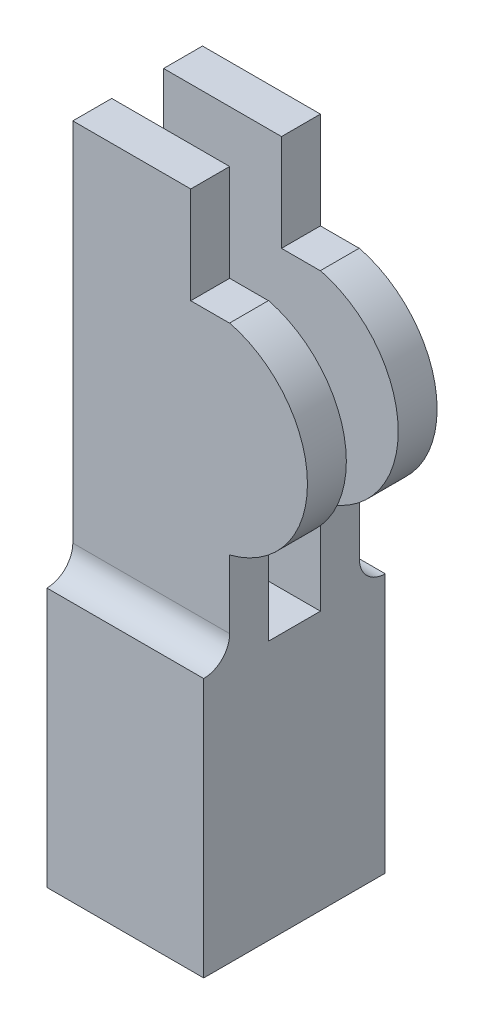
ISO-10303-21;
HEADER;
FILE_DESCRIPTION(('STEP AP214'),'2;1');
FILE_NAME('part.step','',(''),(''),'','','');
FILE_SCHEMA(('AUTOMOTIVE_DESIGN { 1 0 10303 214 1 1 1 1 }'));
ENDSEC;
DATA;
#1=APPLICATION_CONTEXT('core data for automotive mechanical design processes');
#2=APPLICATION_PROTOCOL_DEFINITION('international standard','automotive_design',2000,#1);
#3=PRODUCT_CONTEXT('',#1,'mechanical');
#4=PRODUCT('Part','Part','',(#3));
#5=PRODUCT_RELATED_PRODUCT_CATEGORY('part','',(#4));
#6=PRODUCT_DEFINITION_FORMATION('','',#4);
#7=PRODUCT_DEFINITION_CONTEXT('part definition',#1,'design');
#8=PRODUCT_DEFINITION('design','',#6,#7);
#9=PRODUCT_DEFINITION_SHAPE('','',#8);
#10=(LENGTH_UNIT() NAMED_UNIT(*) SI_UNIT(.MILLI.,.METRE.));
#11=(NAMED_UNIT(*) PLANE_ANGLE_UNIT() SI_UNIT($,.RADIAN.));
#12=(NAMED_UNIT(*) SI_UNIT($,.STERADIAN.) SOLID_ANGLE_UNIT());
#13=UNCERTAINTY_MEASURE_WITH_UNIT(LENGTH_MEASURE(1.E-05),#10,'distance_accuracy_value','');
#14=(GEOMETRIC_REPRESENTATION_CONTEXT(3) GLOBAL_UNCERTAINTY_ASSIGNED_CONTEXT((#13)) GLOBAL_UNIT_ASSIGNED_CONTEXT((#10,
#11,#12)) REPRESENTATION_CONTEXT('',''));
#15=CARTESIAN_POINT('',(0.,0.,0.));
#16=DIRECTION('',(0.,0.,1.));
#17=DIRECTION('',(1.,0.,0.));
#18=AXIS2_PLACEMENT_3D('',#15,#16,#17);
#19=CARTESIAN_POINT('',(-34.4474920895347,12.58,-16.07));
#20=DIRECTION('',(0.,0.,1.));
#21=DIRECTION('',(1.,0.,0.));
#22=AXIS2_PLACEMENT_3D('',#19,#20,#21);
#23=PLANE('',#22);
#24=CARTESIAN_POINT('',(-34.4474920895347,12.58,-16.07));
#25=DIRECTION('',(0.,0.,1.));
#26=DIRECTION('',(1.,0.,0.));
#27=AXIS2_PLACEMENT_3D('',#24,#25,#26);
#28=CIRCLE('',#27,1.25);
#29=CARTESIAN_POINT('',(-33.1974920895347,12.58,-16.07));
#30=VERTEX_POINT('',#29);
#31=EDGE_CURVE('E418',#30,#30,#28,.T.);
#32=ORIENTED_EDGE('',*,*,#31,.F.);
#33=EDGE_LOOP('',(#32));
#34=FACE_BOUND('',#33,.T.);
#35=ADVANCED_FACE('F177',(#34),#23,.F.);
#36=CARTESIAN_POINT('',(-34.45,20.18,-22.9936390438433));
#37=DIRECTION('',(1.,0.,0.));
#38=DIRECTION('',(0.,0.,-1.));
#39=AXIS2_PLACEMENT_3D('',#36,#37,#38);
#40=PLANE('',#39);
#41=DIRECTION('',(0.,0.,1.));
#42=VECTOR('',#41,1.);
#43=CARTESIAN_POINT('',(-34.45,16.4464130979525,-22.9936390438433));
#44=LINE('',#43,#42);
#45=CARTESIAN_POINT('',(-34.45,16.4464130979525,-15.47));
#46=VERTEX_POINT('',#45);
#47=CARTESIAN_POINT('',(-34.45,16.4464130979525,-13.97));
#48=VERTEX_POINT('',#47);
#49=EDGE_CURVE('E382',#46,#48,#44,.T.);
#50=ORIENTED_EDGE('',*,*,#49,.T.);
#51=DIRECTION('',(0.,1.,0.));
#52=VECTOR('',#51,1.);
#53=CARTESIAN_POINT('',(-34.45,20.18,-13.97));
#54=LINE('',#53,#52);
#55=CARTESIAN_POINT('',(-34.45,16.4529833462074,-13.97));
#56=VERTEX_POINT('',#55);
#57=EDGE_CURVE('E354',#48,#56,#54,.T.);
#58=ORIENTED_EDGE('',*,*,#57,.T.);
#59=DIRECTION('',(0.,0.,-1.));
#60=VECTOR('',#59,1.);
#61=CARTESIAN_POINT('',(-34.45,16.4529833462074,-2.65629150101518));
#62=LINE('',#61,#60);
#63=CARTESIAN_POINT('',(-34.45,16.4529833462074,-15.47));
#64=VERTEX_POINT('',#63);
#65=EDGE_CURVE('E506',#56,#64,#62,.T.);
#66=ORIENTED_EDGE('',*,*,#65,.T.);
#67=DIRECTION('',(0.,1.,0.));
#68=VECTOR('',#67,1.);
#69=CARTESIAN_POINT('',(-34.45,20.18,-15.47));
#70=LINE('',#69,#68);
#71=EDGE_CURVE('E400',#46,#64,#70,.T.);
#72=ORIENTED_EDGE('',*,*,#71,.F.);
#73=EDGE_LOOP('',(#50,#58,#66,#72));
#74=FACE_BOUND('',#73,.T.);
#75=ADVANCED_FACE('F591',(#74),#40,.F.);
#76=CARTESIAN_POINT('',(-34.45,16.4464130979525,-22.9936390438433));
#77=DIRECTION('',(0.,-1.,0.));
#78=DIRECTION('',(0.,0.,-1.));
#79=AXIS2_PLACEMENT_3D('',#76,#77,#78);
#80=PLANE('',#79);
#81=DIRECTION('',(0.,0.,1.));
#82=VECTOR('',#81,1.);
#83=CARTESIAN_POINT('',(-35.95,16.4464130979525,-22.9936390438433));
#84=LINE('',#83,#82);
#85=CARTESIAN_POINT('',(-35.95,16.4464130979525,-15.47));
#86=VERTEX_POINT('',#85);
#87=CARTESIAN_POINT('',(-35.95,16.4464130979525,-13.97));
#88=VERTEX_POINT('',#87);
#89=EDGE_CURVE('E388',#86,#88,#84,.T.);
#90=ORIENTED_EDGE('',*,*,#89,.T.);
#91=DIRECTION('',(1.,0.,0.));
#92=VECTOR('',#91,1.);
#93=CARTESIAN_POINT('',(-34.45,16.4464130979525,-13.97));
#94=LINE('',#93,#92);
#95=EDGE_CURVE('E364',#88,#48,#94,.T.);
#96=ORIENTED_EDGE('',*,*,#95,.T.);
#97=ORIENTED_EDGE('',*,*,#49,.F.);
#98=DIRECTION('',(1.,0.,0.));
#99=VECTOR('',#98,1.);
#100=CARTESIAN_POINT('',(-40.4974920895347,16.4464130979525,-15.47));
#101=LINE('',#100,#99);
#102=EDGE_CURVE('E414',#86,#46,#101,.T.);
#103=ORIENTED_EDGE('',*,*,#102,.F.);
#104=EDGE_LOOP('',(#90,#96,#97,#103));
#105=FACE_BOUND('',#104,.T.);
#106=ADVANCED_FACE('F597',(#105),#80,.F.);
#107=CARTESIAN_POINT('',(-35.95,20.18,-22.9936390438433));
#108=DIRECTION('',(-1.,0.,0.));
#109=DIRECTION('',(0.,0.,1.));
#110=AXIS2_PLACEMENT_3D('',#107,#108,#109);
#111=PLANE('',#110);
#112=DIRECTION('',(0.,0.,1.));
#113=VECTOR('',#112,1.);
#114=CARTESIAN_POINT('',(-35.95,20.18,-22.9936390438433));
#115=LINE('',#114,#113);
#116=CARTESIAN_POINT('',(-35.95,20.18,-15.47));
#117=VERTEX_POINT('',#116);
#118=CARTESIAN_POINT('',(-35.95,20.18,-13.97));
#119=VERTEX_POINT('',#118);
#120=EDGE_CURVE('E368',#117,#119,#115,.T.);
#121=ORIENTED_EDGE('',*,*,#120,.T.);
#122=DIRECTION('',(0.,-1.,0.));
#123=VECTOR('',#122,1.);
#124=CARTESIAN_POINT('',(-35.95,20.18,-13.97));
#125=LINE('',#124,#123);
#126=EDGE_CURVE('E358',#119,#88,#125,.T.);
#127=ORIENTED_EDGE('',*,*,#126,.T.);
#128=ORIENTED_EDGE('',*,*,#89,.F.);
#129=DIRECTION('',(0.,-1.,0.));
#130=VECTOR('',#129,1.);
#131=CARTESIAN_POINT('',(-35.95,20.18,-15.47));
#132=LINE('',#131,#130);
#133=EDGE_CURVE('E407',#117,#86,#132,.T.);
#134=ORIENTED_EDGE('',*,*,#133,.F.);
#135=EDGE_LOOP('',(#121,#127,#128,#134));
#136=FACE_BOUND('',#135,.T.);
#137=ADVANCED_FACE('F609',(#136),#111,.F.);
#138=CARTESIAN_POINT('',(-34.4474920895347,12.58,-16.07));
#139=DIRECTION('',(0.,0.,1.));
#140=DIRECTION('',(1.,0.,0.));
#141=AXIS2_PLACEMENT_3D('',#138,#139,#140);
#142=CYLINDRICAL_SURFACE('',#141,1.25);
#143=ORIENTED_EDGE('',*,*,#31,.T.);
#144=EDGE_LOOP('',(#143));
#145=FACE_BOUND('',#144,.T.);
#146=CARTESIAN_POINT('',(-34.4474920895347,12.58,-15.47));
#147=DIRECTION('',(0.,0.,1.));
#148=DIRECTION('',(1.,0.,0.));
#149=AXIS2_PLACEMENT_3D('',#146,#147,#148);
#150=CIRCLE('',#149,1.25);
#151=CARTESIAN_POINT('',(-33.1974920895347,12.58,-15.47));
#152=VERTEX_POINT('',#151);
#153=EDGE_CURVE('E422',#152,#152,#150,.T.);
#154=ORIENTED_EDGE('',*,*,#153,.F.);
#155=EDGE_LOOP('',(#154));
#156=FACE_BOUND('',#155,.T.);
#157=ADVANCED_FACE('F606',(#145,#156),#142,.T.);
#158=DIRECTION('',(1.,0.,0.));
#159=VECTOR('',#158,1.);
#160=CARTESIAN_POINT('',(-40.4974920895347,16.4464130979525,-17.47));
#161=LINE('',#160,#159);
#162=CARTESIAN_POINT('',(-35.95,16.4464130979525,-17.47));
#163=VERTEX_POINT('',#162);
#164=CARTESIAN_POINT('',(-34.45,16.4464130979525,-17.47));
#165=VERTEX_POINT('',#164);
#166=EDGE_CURVE('E411',#163,#165,#161,.T.);
#167=ORIENTED_EDGE('',*,*,#166,.T.);
#168=CARTESIAN_POINT('',(-34.45,16.4464130979525,-18.97));
#169=VERTEX_POINT('',#168);
#170=EDGE_CURVE('E377',#169,#165,#44,.T.);
#171=ORIENTED_EDGE('',*,*,#170,.F.);
#172=DIRECTION('',(1.,0.,0.));
#173=VECTOR('',#172,1.);
#174=CARTESIAN_POINT('',(-34.45,16.4464130979525,-18.97));
#175=LINE('',#174,#173);
#176=CARTESIAN_POINT('',(-35.95,16.4464130979525,-18.97));
#177=VERTEX_POINT('',#176);
#178=EDGE_CURVE('E378',#177,#169,#175,.T.);
#179=ORIENTED_EDGE('',*,*,#178,.F.);
#180=EDGE_CURVE('E383',#177,#163,#84,.T.);
#181=ORIENTED_EDGE('',*,*,#180,.T.);
#182=EDGE_LOOP('',(#167,#171,#179,#181));
#183=FACE_BOUND('',#182,.T.);
#184=ADVANCED_FACE('F608',(#183),#80,.F.);
#185=DIRECTION('',(0.,1.,0.));
#186=VECTOR('',#185,1.);
#187=CARTESIAN_POINT('',(-34.45,20.18,-17.47));
#188=LINE('',#187,#186);
#189=CARTESIAN_POINT('',(-34.45,16.4529833462074,-17.4699999999999));
#190=VERTEX_POINT('',#189);
#191=EDGE_CURVE('E376',#165,#190,#188,.T.);
#192=ORIENTED_EDGE('',*,*,#191,.T.);
#193=DIRECTION('',(0.,0.,1.));
#194=VECTOR('',#193,1.);
#195=CARTESIAN_POINT('',(-34.45,16.4529833462074,-32.2837084989847));
#196=LINE('',#195,#194);
#197=CARTESIAN_POINT('',(-34.45,16.4529833462074,-18.97));
#198=VERTEX_POINT('',#197);
#199=EDGE_CURVE('E462',#190,#198,#196,.F.);
#200=ORIENTED_EDGE('',*,*,#199,.T.);
#201=DIRECTION('',(0.,1.,0.));
#202=VECTOR('',#201,1.);
#203=CARTESIAN_POINT('',(-34.45,20.18,-18.97));
#204=LINE('',#203,#202);
#205=EDGE_CURVE('E372',#169,#198,#204,.T.);
#206=ORIENTED_EDGE('',*,*,#205,.F.);
#207=ORIENTED_EDGE('',*,*,#170,.T.);
#208=EDGE_LOOP('',(#192,#200,#206,#207));
#209=FACE_BOUND('',#208,.T.);
#210=ADVANCED_FACE('F600',(#209),#40,.F.);
#211=DIRECTION('',(0.,-1.,0.));
#212=VECTOR('',#211,1.);
#213=CARTESIAN_POINT('',(-35.95,20.18,-17.47));
#214=LINE('',#213,#212);
#215=CARTESIAN_POINT('',(-35.95,20.18,-17.47));
#216=VERTEX_POINT('',#215);
#217=EDGE_CURVE('E404',#216,#163,#214,.T.);
#218=ORIENTED_EDGE('',*,*,#217,.T.);
#219=ORIENTED_EDGE('',*,*,#180,.F.);
#220=DIRECTION('',(0.,-1.,0.));
#221=VECTOR('',#220,1.);
#222=CARTESIAN_POINT('',(-35.95,20.18,-18.97));
#223=LINE('',#222,#221);
#224=CARTESIAN_POINT('',(-35.95,20.18,-18.97));
#225=VERTEX_POINT('',#224);
#226=EDGE_CURVE('E384',#225,#177,#223,.T.);
#227=ORIENTED_EDGE('',*,*,#226,.F.);
#228=EDGE_CURVE('E389',#225,#216,#115,.T.);
#229=ORIENTED_EDGE('',*,*,#228,.T.);
#230=EDGE_LOOP('',(#218,#219,#227,#229));
#231=FACE_BOUND('',#230,.T.);
#232=ADVANCED_FACE('F604',(#231),#111,.F.);
#233=CARTESIAN_POINT('',(-35.45,12.58,-32.2837084989847));
#234=DIRECTION('',(0.,0.,1.));
#235=DIRECTION('',(1.,0.,0.));
#236=AXIS2_PLACEMENT_3D('',#233,#234,#235);
#237=CYLINDRICAL_SURFACE('',#236,4.00000000000001);
#238=ORIENTED_EDGE('',*,*,#199,.F.);
#239=CARTESIAN_POINT('',(-35.45,12.58,-17.4699999999999));
#240=DIRECTION('',(0.,0.,-1.));
#241=DIRECTION('',(-1.,0.,0.));
#242=AXIS2_PLACEMENT_3D('',#239,#240,#241);
#243=CIRCLE('',#242,4.00000000000001);
#244=CARTESIAN_POINT('',(-34.45,8.70701665379258,-17.4699999999999));
#245=VERTEX_POINT('',#244);
#246=EDGE_CURVE('E451',#190,#245,#243,.T.);
#247=ORIENTED_EDGE('',*,*,#246,.T.);
#248=DIRECTION('',(0.,0.,1.));
#249=VECTOR('',#248,1.);
#250=CARTESIAN_POINT('',(-34.45,8.70701665379258,-32.2837084989847));
#251=LINE('',#250,#249);
#252=CARTESIAN_POINT('',(-34.45,8.70701665379258,-18.97));
#253=VERTEX_POINT('',#252);
#254=EDGE_CURVE('E458',#253,#245,#251,.T.);
#255=ORIENTED_EDGE('',*,*,#254,.F.);
#256=CARTESIAN_POINT('',(-35.45,12.58,-18.97));
#257=DIRECTION('',(0.,0.,1.));
#258=DIRECTION('',(1.,0.,0.));
#259=AXIS2_PLACEMENT_3D('',#256,#257,#258);
#260=CIRCLE('',#259,4.00000000000001);
#261=EDGE_CURVE('E454',#253,#198,#260,.T.);
#262=ORIENTED_EDGE('',*,*,#261,.T.);
#263=EDGE_LOOP('',(#238,#247,#255,#262));
#264=FACE_BOUND('',#263,.T.);
#265=ADVANCED_FACE('F617',(#264),#237,.T.);
#266=CARTESIAN_POINT('',(0.,20.18,-32.9399999999999));
#267=DIRECTION('',(0.,1.,0.));
#268=DIRECTION('',(0.,0.,-1.));
#269=AXIS2_PLACEMENT_3D('',#266,#267,#268);
#270=PLANE('',#269);
#271=ORIENTED_EDGE('',*,*,#228,.F.);
#272=DIRECTION('',(1.,0.,0.));
#273=VECTOR('',#272,1.);
#274=CARTESIAN_POINT('',(-40.4974920895347,20.18,-18.97));
#275=LINE('',#274,#273);
#276=CARTESIAN_POINT('',(-40.4974920895347,20.18,-18.97));
#277=VERTEX_POINT('',#276);
#278=EDGE_CURVE('E473',#277,#225,#275,.T.);
#279=ORIENTED_EDGE('',*,*,#278,.F.);
#280=DIRECTION('',(0.,0.,-1.));
#281=VECTOR('',#280,1.);
#282=CARTESIAN_POINT('',(-40.4974920895347,20.18,-17.47));
#283=LINE('',#282,#281);
#284=CARTESIAN_POINT('',(-40.4974920895347,20.18,-17.47));
#285=VERTEX_POINT('',#284);
#286=EDGE_CURVE('E466',#285,#277,#283,.T.);
#287=ORIENTED_EDGE('',*,*,#286,.F.);
#288=DIRECTION('',(-1.,0.,0.));
#289=VECTOR('',#288,1.);
#290=CARTESIAN_POINT('',(-40.4974920895347,20.18,-17.47));
#291=LINE('',#290,#289);
#292=EDGE_CURVE('E470',#216,#285,#291,.T.);
#293=ORIENTED_EDGE('',*,*,#292,.F.);
#294=EDGE_LOOP('',(#271,#279,#287,#293));
#295=FACE_BOUND('',#294,.T.);
#296=ADVANCED_FACE('F620',(#295),#270,.T.);
#297=CARTESIAN_POINT('',(0.,20.18,0.));
#298=DIRECTION('',(0.,1.,0.));
#299=DIRECTION('',(0.,0.,1.));
#300=AXIS2_PLACEMENT_3D('',#297,#298,#299);
#301=PLANE('',#300);
#302=ORIENTED_EDGE('',*,*,#120,.F.);
#303=DIRECTION('',(-1.,0.,0.));
#304=VECTOR('',#303,1.);
#305=CARTESIAN_POINT('',(-40.4974920895347,20.18,-15.47));
#306=LINE('',#305,#304);
#307=CARTESIAN_POINT('',(-40.4974920895347,20.18,-15.47));
#308=VERTEX_POINT('',#307);
#309=EDGE_CURVE('E518',#117,#308,#306,.T.);
#310=ORIENTED_EDGE('',*,*,#309,.T.);
#311=DIRECTION('',(0.,0.,1.));
#312=VECTOR('',#311,1.);
#313=CARTESIAN_POINT('',(-40.4974920895347,20.18,-15.47));
#314=LINE('',#313,#312);
#315=CARTESIAN_POINT('',(-40.4974920895347,20.18,-13.97));
#316=VERTEX_POINT('',#315);
#317=EDGE_CURVE('E510',#308,#316,#314,.T.);
#318=ORIENTED_EDGE('',*,*,#317,.T.);
#319=DIRECTION('',(1.,0.,0.));
#320=VECTOR('',#319,1.);
#321=CARTESIAN_POINT('',(-40.4974920895347,20.18,-13.97));
#322=LINE('',#321,#320);
#323=EDGE_CURVE('E514',#316,#119,#322,.T.);
#324=ORIENTED_EDGE('',*,*,#323,.T.);
#325=EDGE_LOOP('',(#302,#310,#318,#324));
#326=FACE_BOUND('',#325,.T.);
#327=ADVANCED_FACE('F624',(#326),#301,.T.);
#328=CARTESIAN_POINT('',(-35.45,12.58,-2.65629150101518));
#329=DIRECTION('',(0.,0.,-1.));
#330=DIRECTION('',(-1.,0.,0.));
#331=AXIS2_PLACEMENT_3D('',#328,#329,#330);
#332=CYLINDRICAL_SURFACE('',#331,4.00000000000001);
#333=ORIENTED_EDGE('',*,*,#65,.F.);
#334=CARTESIAN_POINT('',(-35.45,12.58,-13.97));
#335=DIRECTION('',(0.,0.,-1.));
#336=DIRECTION('',(-1.,0.,0.));
#337=AXIS2_PLACEMENT_3D('',#334,#335,#336);
#338=CIRCLE('',#337,4.00000000000001);
#339=CARTESIAN_POINT('',(-34.45,8.70701665379258,-13.97));
#340=VERTEX_POINT('',#339);
#341=EDGE_CURVE('E498',#340,#56,#338,.F.);
#342=ORIENTED_EDGE('',*,*,#341,.F.);
#343=DIRECTION('',(0.,0.,-1.));
#344=VECTOR('',#343,1.);
#345=CARTESIAN_POINT('',(-34.45,8.70701665379258,-2.65629150101518));
#346=LINE('',#345,#344);
#347=CARTESIAN_POINT('',(-34.45,8.70701665379258,-15.47));
#348=VERTEX_POINT('',#347);
#349=EDGE_CURVE('E502',#348,#340,#346,.F.);
#350=ORIENTED_EDGE('',*,*,#349,.F.);
#351=CARTESIAN_POINT('',(-35.45,12.58,-15.47));
#352=DIRECTION('',(0.,0.,-1.));
#353=DIRECTION('',(-1.,0.,0.));
#354=AXIS2_PLACEMENT_3D('',#351,#352,#353);
#355=CIRCLE('',#354,4.00000000000001);
#356=EDGE_CURVE('E494',#64,#348,#355,.T.);
#357=ORIENTED_EDGE('',*,*,#356,.F.);
#358=EDGE_LOOP('',(#333,#342,#350,#357));
#359=FACE_BOUND('',#358,.T.);
#360=ADVANCED_FACE('F615',(#359),#332,.T.);
#361=CARTESIAN_POINT('',(-40.4974920895347,11.08,-25.2945553203367));
#362=DIRECTION('',(0.,-1.,0.));
#363=DIRECTION('',(0.,0.,-1.));
#364=AXIS2_PLACEMENT_3D('',#361,#362,#363);
#365=PLANE('',#364);
#366=DIRECTION('',(1.,0.,0.));
#367=VECTOR('',#366,1.);
#368=CARTESIAN_POINT('',(-40.4974920895347,11.08,-17.47));
#369=LINE('',#368,#367);
#370=CARTESIAN_POINT('',(-40.4974920895347,11.08,-17.47));
#371=VERTEX_POINT('',#370);
#372=CARTESIAN_POINT('',(-38.4974920895347,11.08,-17.47));
#373=VERTEX_POINT('',#372);
#374=EDGE_CURVE('E447',#371,#373,#369,.T.);
#375=ORIENTED_EDGE('',*,*,#374,.F.);
#376=DIRECTION('',(0.,0.,1.));
#377=VECTOR('',#376,1.);
#378=CARTESIAN_POINT('',(-40.4974920895347,11.08,-25.2945553203367));
#379=LINE('',#378,#377);
#380=CARTESIAN_POINT('',(-40.4974920895347,11.08,-15.47));
#381=VERTEX_POINT('',#380);
#382=EDGE_CURVE('E426',#371,#381,#379,.T.);
#383=ORIENTED_EDGE('',*,*,#382,.T.);
#384=DIRECTION('',(1.,0.,0.));
#385=VECTOR('',#384,1.);
#386=CARTESIAN_POINT('',(-40.4974920895347,11.08,-15.47));
#387=LINE('',#386,#385);
#388=CARTESIAN_POINT('',(-38.4974920895347,11.08,-15.47));
#389=VERTEX_POINT('',#388);
#390=EDGE_CURVE('E432',#381,#389,#387,.T.);
#391=ORIENTED_EDGE('',*,*,#390,.T.);
#392=DIRECTION('',(0.,0.,1.));
#393=VECTOR('',#392,1.);
#394=CARTESIAN_POINT('',(-38.4974920895347,11.08,-25.2945553203367));
#395=LINE('',#394,#393);
#396=EDGE_CURVE('E431',#373,#389,#395,.T.);
#397=ORIENTED_EDGE('',*,*,#396,.F.);
#398=EDGE_LOOP('',(#375,#383,#391,#397));
#399=FACE_BOUND('',#398,.T.);
#400=ADVANCED_FACE('F612',(#399),#365,.F.);
#401=CARTESIAN_POINT('',(-40.4974920895347,20.18,-18.97));
#402=DIRECTION('',(0.,0.,-1.));
#403=DIRECTION('',(-1.,0.,0.));
#404=AXIS2_PLACEMENT_3D('',#401,#402,#403);
#405=PLANE('',#404);
#406=ORIENTED_EDGE('',*,*,#226,.T.);
#407=ORIENTED_EDGE('',*,*,#178,.T.);
#408=ORIENTED_EDGE('',*,*,#205,.T.);
#409=ORIENTED_EDGE('',*,*,#261,.F.);
#410=DIRECTION('',(0.,-1.,0.));
#411=VECTOR('',#410,1.);
#412=CARTESIAN_POINT('',(-34.45,20.18,-18.97));
#413=LINE('',#412,#411);
#414=CARTESIAN_POINT('',(-34.45,6.08,-18.97));
#415=VERTEX_POINT('',#414);
#416=EDGE_CURVE('E483',#253,#415,#413,.T.);
#417=ORIENTED_EDGE('',*,*,#416,.T.);
#418=DIRECTION('',(1.,0.,0.));
#419=VECTOR('',#418,1.);
#420=CARTESIAN_POINT('',(-40.4974920895347,6.08,-18.97));
#421=LINE('',#420,#419);
#422=CARTESIAN_POINT('',(-40.4974920895347,6.08,-18.97));
#423=VERTEX_POINT('',#422);
#424=EDGE_CURVE('E545',#415,#423,#421,.F.);
#425=ORIENTED_EDGE('',*,*,#424,.T.);
#426=DIRECTION('',(0.,-1.,0.));
#427=VECTOR('',#426,1.);
#428=CARTESIAN_POINT('',(-40.4974920895347,20.18,-18.97));
#429=LINE('',#428,#427);
#430=EDGE_CURVE('E477',#277,#423,#429,.T.);
#431=ORIENTED_EDGE('',*,*,#430,.F.);
#432=ORIENTED_EDGE('',*,*,#278,.T.);
#433=EDGE_LOOP('',(#406,#407,#408,#409,#417,#425,#431,#432));
#434=FACE_BOUND('',#433,.T.);
#435=ADVANCED_FACE('F577',(#434),#405,.T.);
#436=CARTESIAN_POINT('',(-40.4974920895347,20.18,-13.97));
#437=DIRECTION('',(0.,0.,-1.));
#438=DIRECTION('',(-1.,0.,0.));
#439=AXIS2_PLACEMENT_3D('',#436,#437,#438);
#440=PLANE('',#439);
#441=ORIENTED_EDGE('',*,*,#95,.F.);
#442=ORIENTED_EDGE('',*,*,#126,.F.);
#443=ORIENTED_EDGE('',*,*,#323,.F.);
#444=DIRECTION('',(0.,-1.,0.));
#445=VECTOR('',#444,1.);
#446=CARTESIAN_POINT('',(-40.4974920895347,20.18,-13.97));
#447=LINE('',#446,#445);
#448=CARTESIAN_POINT('',(-40.4974920895347,6.08,-13.97));
#449=VERTEX_POINT('',#448);
#450=EDGE_CURVE('E535',#316,#449,#447,.T.);
#451=ORIENTED_EDGE('',*,*,#450,.T.);
#452=DIRECTION('',(1.,0.,0.));
#453=VECTOR('',#452,1.);
#454=CARTESIAN_POINT('',(-34.45,6.08,-13.97));
#455=LINE('',#454,#453);
#456=CARTESIAN_POINT('',(-34.45,6.08,-13.97));
#457=VERTEX_POINT('',#456);
#458=EDGE_CURVE('E548',#449,#457,#455,.T.);
#459=ORIENTED_EDGE('',*,*,#458,.T.);
#460=DIRECTION('',(0.,-1.,0.));
#461=VECTOR('',#460,1.);
#462=CARTESIAN_POINT('',(-34.45,20.18,-13.97));
#463=LINE('',#462,#461);
#464=EDGE_CURVE('E531',#340,#457,#463,.T.);
#465=ORIENTED_EDGE('',*,*,#464,.F.);
#466=ORIENTED_EDGE('',*,*,#341,.T.);
#467=ORIENTED_EDGE('',*,*,#57,.F.);
#468=EDGE_LOOP('',(#441,#442,#443,#451,#459,#465,#466,#467));
#469=FACE_BOUND('',#468,.T.);
#470=ADVANCED_FACE('F586',(#469),#440,.F.);
#471=CARTESIAN_POINT('',(-38.4974920895347,5.08,-25.2945553203367));
#472=DIRECTION('',(-1.,0.,0.));
#473=DIRECTION('',(0.,0.,1.));
#474=AXIS2_PLACEMENT_3D('',#471,#472,#473);
#475=PLANE('',#474);
#476=DIRECTION('',(0.,-1.,0.));
#477=VECTOR('',#476,1.);
#478=CARTESIAN_POINT('',(-38.4974920895347,20.18,-17.47));
#479=LINE('',#478,#477);
#480=CARTESIAN_POINT('',(-38.4974920895347,5.08,-17.47));
#481=VERTEX_POINT('',#480);
#482=EDGE_CURVE('E443',#373,#481,#479,.T.);
#483=ORIENTED_EDGE('',*,*,#482,.F.);
#484=ORIENTED_EDGE('',*,*,#396,.T.);
#485=DIRECTION('',(0.,-1.,0.));
#486=VECTOR('',#485,1.);
#487=CARTESIAN_POINT('',(-38.4974920895347,5.08,-15.47));
#488=LINE('',#487,#486);
#489=CARTESIAN_POINT('',(-38.4974920895347,5.08,-15.47));
#490=VERTEX_POINT('',#489);
#491=EDGE_CURVE('E427',#389,#490,#488,.T.);
#492=ORIENTED_EDGE('',*,*,#491,.T.);
#493=DIRECTION('',(0.,0.,1.));
#494=VECTOR('',#493,1.);
#495=CARTESIAN_POINT('',(-38.4974920895347,5.08,-25.2945553203367));
#496=LINE('',#495,#494);
#497=EDGE_CURVE('E430',#481,#490,#496,.T.);
#498=ORIENTED_EDGE('',*,*,#497,.F.);
#499=EDGE_LOOP('',(#483,#484,#492,#498));
#500=FACE_BOUND('',#499,.T.);
#501=ADVANCED_FACE('F581',(#500),#475,.F.);
#502=CARTESIAN_POINT('',(0.,6.08,-19.97));
#503=DIRECTION('',(1.,0.,0.));
#504=DIRECTION('',(0.,0.,-1.));
#505=AXIS2_PLACEMENT_3D('',#502,#503,#504);
#506=CYLINDRICAL_SURFACE('',#505,1.);
#507=CARTESIAN_POINT('',(-40.4974920895347,6.08,-19.97));
#508=DIRECTION('',(1.,0.,0.));
#509=DIRECTION('',(0.,0.,-1.));
#510=AXIS2_PLACEMENT_3D('',#507,#508,#509);
#511=CIRCLE('',#510,1.);
#512=CARTESIAN_POINT('',(-40.4974920895347,5.08,-19.97));
#513=VERTEX_POINT('',#512);
#514=EDGE_CURVE('E351',#423,#513,#511,.T.);
#515=ORIENTED_EDGE('',*,*,#514,.F.);
#516=ORIENTED_EDGE('',*,*,#424,.F.);
#517=CARTESIAN_POINT('',(-34.45,6.08,-19.97));
#518=DIRECTION('',(1.,0.,0.));
#519=DIRECTION('',(0.,0.,-1.));
#520=AXIS2_PLACEMENT_3D('',#517,#518,#519);
#521=CIRCLE('',#520,1.);
#522=CARTESIAN_POINT('',(-34.45,5.08,-19.97));
#523=VERTEX_POINT('',#522);
#524=EDGE_CURVE('E551',#523,#415,#521,.F.);
#525=ORIENTED_EDGE('',*,*,#524,.F.);
#526=DIRECTION('',(1.,0.,0.));
#527=VECTOR('',#526,1.);
#528=CARTESIAN_POINT('',(0.,5.08,-19.97));
#529=LINE('',#528,#527);
#530=EDGE_CURVE('E542',#513,#523,#529,.T.);
#531=ORIENTED_EDGE('',*,*,#530,.F.);
#532=EDGE_LOOP('',(#515,#516,#525,#531));
#533=FACE_BOUND('',#532,.T.);
#534=ADVANCED_FACE('F579',(#533),#506,.F.);
#535=CARTESIAN_POINT('',(-40.4974920895347,6.08,-12.97));
#536=DIRECTION('',(-1.,0.,0.));
#537=DIRECTION('',(0.,0.,1.));
#538=AXIS2_PLACEMENT_3D('',#535,#536,#537);
#539=CYLINDRICAL_SURFACE('',#538,1.);
#540=CARTESIAN_POINT('',(-40.4974920895347,6.08,-12.97));
#541=DIRECTION('',(1.,0.,0.));
#542=DIRECTION('',(0.,0.,-1.));
#543=AXIS2_PLACEMENT_3D('',#540,#541,#542);
#544=CIRCLE('',#543,1.);
#545=CARTESIAN_POINT('',(-40.4974920895347,5.08,-12.97));
#546=VERTEX_POINT('',#545);
#547=EDGE_CURVE('E12',#546,#449,#544,.T.);
#548=ORIENTED_EDGE('',*,*,#547,.F.);
#549=DIRECTION('',(1.,0.,0.));
#550=VECTOR('',#549,1.);
#551=CARTESIAN_POINT('',(-40.4974920895347,5.08,-12.97));
#552=LINE('',#551,#550);
#553=CARTESIAN_POINT('',(-34.45,5.08,-12.97));
#554=VERTEX_POINT('',#553);
#555=EDGE_CURVE('E538',#554,#546,#552,.F.);
#556=ORIENTED_EDGE('',*,*,#555,.F.);
#557=CARTESIAN_POINT('',(-34.45,6.08,-12.97));
#558=DIRECTION('',(-1.,0.,0.));
#559=DIRECTION('',(0.,0.,1.));
#560=AXIS2_PLACEMENT_3D('',#557,#558,#559);
#561=CIRCLE('',#560,1.);
#562=EDGE_CURVE('E186',#457,#554,#561,.T.);
#563=ORIENTED_EDGE('',*,*,#562,.F.);
#564=ORIENTED_EDGE('',*,*,#458,.F.);
#565=EDGE_LOOP('',(#548,#556,#563,#564));
#566=FACE_BOUND('',#565,.T.);
#567=ADVANCED_FACE('F179',(#566),#539,.F.);
#568=CARTESIAN_POINT('',(-34.45,20.18,-15.47));
#569=DIRECTION('',(-1.,0.,0.));
#570=DIRECTION('',(0.,0.,1.));
#571=AXIS2_PLACEMENT_3D('',#568,#569,#570);
#572=PLANE('',#571);
#573=DIRECTION('',(0.,-1.,0.));
#574=VECTOR('',#573,1.);
#575=CARTESIAN_POINT('',(-34.45,20.18,-15.47));
#576=LINE('',#575,#574);
#577=CARTESIAN_POINT('',(-34.45,5.08,-15.47));
#578=VERTEX_POINT('',#577);
#579=EDGE_CURVE('E528',#348,#578,#576,.T.);
#580=ORIENTED_EDGE('',*,*,#579,.F.);
#581=ORIENTED_EDGE('',*,*,#349,.T.);
#582=ORIENTED_EDGE('',*,*,#464,.T.);
#583=ORIENTED_EDGE('',*,*,#562,.T.);
#584=DIRECTION('',(0.,1.,0.));
#585=VECTOR('',#584,1.);
#586=CARTESIAN_POINT('',(-34.45,-4.92,-12.97));
#587=LINE('',#586,#585);
#588=CARTESIAN_POINT('',(-34.45,-4.92,-12.97));
#589=VERTEX_POINT('',#588);
#590=EDGE_CURVE('E360',#589,#554,#587,.T.);
#591=ORIENTED_EDGE('',*,*,#590,.F.);
#592=DIRECTION('',(0.,0.,1.));
#593=VECTOR('',#592,1.);
#594=CARTESIAN_POINT('',(-34.45,-4.92,-12.97));
#595=LINE('',#594,#593);
#596=CARTESIAN_POINT('',(-34.45,-4.92,-19.97));
#597=VERTEX_POINT('',#596);
#598=EDGE_CURVE('E337',#597,#589,#595,.T.);
#599=ORIENTED_EDGE('',*,*,#598,.F.);
#600=DIRECTION('',(0.,1.,0.));
#601=VECTOR('',#600,1.);
#602=CARTESIAN_POINT('',(-34.45,-4.92,-19.97));
#603=LINE('',#602,#601);
#604=EDGE_CURVE('E333',#597,#523,#603,.T.);
#605=ORIENTED_EDGE('',*,*,#604,.T.);
#606=ORIENTED_EDGE('',*,*,#524,.T.);
#607=ORIENTED_EDGE('',*,*,#416,.F.);
#608=ORIENTED_EDGE('',*,*,#254,.T.);
#609=DIRECTION('',(0.,-1.,0.));
#610=VECTOR('',#609,1.);
#611=CARTESIAN_POINT('',(-34.45,20.18,-17.47));
#612=LINE('',#611,#610);
#613=CARTESIAN_POINT('',(-34.45,5.08,-17.4699999999999));
#614=VERTEX_POINT('',#613);
#615=EDGE_CURVE('E487',#245,#614,#612,.T.);
#616=ORIENTED_EDGE('',*,*,#615,.T.);
#617=DIRECTION('',(0.,0.,1.));
#618=VECTOR('',#617,1.);
#619=CARTESIAN_POINT('',(-34.45,5.08,-12.97));
#620=LINE('',#619,#618);
#621=EDGE_CURVE('E346',#614,#578,#620,.T.);
#622=ORIENTED_EDGE('',*,*,#621,.T.);
#623=EDGE_LOOP('',(#580,#581,#582,#583,#591,#599,#605,#606,#607,#608,#616,#622));
#624=FACE_BOUND('',#623,.T.);
#625=ADVANCED_FACE('F558',(#624),#572,.F.);
#626=CARTESIAN_POINT('',(-40.4974920895347,20.18,-15.47));
#627=DIRECTION('',(1.,0.,0.));
#628=DIRECTION('',(0.,0.,-1.));
#629=AXIS2_PLACEMENT_3D('',#626,#627,#628);
#630=PLANE('',#629);
#631=ORIENTED_EDGE('',*,*,#514,.T.);
#632=DIRECTION('',(0.,1.,0.));
#633=VECTOR('',#632,1.);
#634=CARTESIAN_POINT('',(-40.4974920895347,-4.92,-19.97));
#635=LINE('',#634,#633);
#636=CARTESIAN_POINT('',(-40.4974920895347,-4.92,-19.97));
#637=VERTEX_POINT('',#636);
#638=EDGE_CURVE('E331',#637,#513,#635,.T.);
#639=ORIENTED_EDGE('',*,*,#638,.F.);
#640=DIRECTION('',(0.,0.,-1.));
#641=VECTOR('',#640,1.);
#642=CARTESIAN_POINT('',(-40.4974920895347,-4.92,-12.97));
#643=LINE('',#642,#641);
#644=CARTESIAN_POINT('',(-40.4974920895347,-4.92,-12.97));
#645=VERTEX_POINT('',#644);
#646=EDGE_CURVE('E338',#645,#637,#643,.T.);
#647=ORIENTED_EDGE('',*,*,#646,.F.);
#648=DIRECTION('',(0.,1.,0.));
#649=VECTOR('',#648,1.);
#650=CARTESIAN_POINT('',(-40.4974920895347,-4.92,-12.97));
#651=LINE('',#650,#649);
#652=EDGE_CURVE('E563',#645,#546,#651,.T.);
#653=ORIENTED_EDGE('',*,*,#652,.T.);
#654=ORIENTED_EDGE('',*,*,#547,.T.);
#655=ORIENTED_EDGE('',*,*,#450,.F.);
#656=ORIENTED_EDGE('',*,*,#317,.F.);
#657=DIRECTION('',(0.,-1.,0.));
#658=VECTOR('',#657,1.);
#659=CARTESIAN_POINT('',(-40.4974920895347,20.18,-15.47));
#660=LINE('',#659,#658);
#661=EDGE_CURVE('E521',#308,#381,#660,.T.);
#662=ORIENTED_EDGE('',*,*,#661,.T.);
#663=ORIENTED_EDGE('',*,*,#382,.F.);
#664=DIRECTION('',(0.,-1.,0.));
#665=VECTOR('',#664,1.);
#666=CARTESIAN_POINT('',(-40.4974920895347,20.18,-17.47));
#667=LINE('',#666,#665);
#668=EDGE_CURVE('E490',#285,#371,#667,.T.);
#669=ORIENTED_EDGE('',*,*,#668,.F.);
#670=ORIENTED_EDGE('',*,*,#286,.T.);
#671=ORIENTED_EDGE('',*,*,#430,.T.);
#672=EDGE_LOOP('',(#631,#639,#647,#653,#654,#655,#656,#662,#663,#669,#670,#671));
#673=FACE_BOUND('',#672,.T.);
#674=ADVANCED_FACE('F348',(#673),#630,.F.);
#675=CARTESIAN_POINT('',(-40.4974920895347,20.18,-17.47));
#676=DIRECTION('',(0.,0.,1.));
#677=DIRECTION('',(1.,0.,0.));
#678=AXIS2_PLACEMENT_3D('',#675,#676,#677);
#679=PLANE('',#678);
#680=ORIENTED_EDGE('',*,*,#217,.F.);
#681=ORIENTED_EDGE('',*,*,#292,.T.);
#682=ORIENTED_EDGE('',*,*,#668,.T.);
#683=ORIENTED_EDGE('',*,*,#374,.T.);
#684=ORIENTED_EDGE('',*,*,#482,.T.);
#685=DIRECTION('',(-1.,0.,0.));
#686=VECTOR('',#685,1.);
#687=CARTESIAN_POINT('',(-40.4974920895347,5.08,-17.47));
#688=LINE('',#687,#686);
#689=EDGE_CURVE('E465',#614,#481,#688,.T.);
#690=ORIENTED_EDGE('',*,*,#689,.F.);
#691=ORIENTED_EDGE('',*,*,#615,.F.);
#692=ORIENTED_EDGE('',*,*,#246,.F.);
#693=ORIENTED_EDGE('',*,*,#191,.F.);
#694=ORIENTED_EDGE('',*,*,#166,.F.);
#695=EDGE_LOOP('',(#680,#681,#682,#683,#684,#690,#691,#692,#693,#694));
#696=FACE_BOUND('',#695,.T.);
#697=ADVANCED_FACE('F628',(#696),#679,.T.);
#698=CARTESIAN_POINT('',(-40.4974920895347,20.18,-15.47));
#699=DIRECTION('',(0.,0.,1.));
#700=DIRECTION('',(1.,0.,0.));
#701=AXIS2_PLACEMENT_3D('',#698,#699,#700);
#702=PLANE('',#701);
#703=ORIENTED_EDGE('',*,*,#153,.T.);
#704=EDGE_LOOP('',(#703));
#705=FACE_BOUND('',#704,.T.);
#706=ORIENTED_EDGE('',*,*,#309,.F.);
#707=ORIENTED_EDGE('',*,*,#133,.T.);
#708=ORIENTED_EDGE('',*,*,#102,.T.);
#709=ORIENTED_EDGE('',*,*,#71,.T.);
#710=ORIENTED_EDGE('',*,*,#356,.T.);
#711=ORIENTED_EDGE('',*,*,#579,.T.);
#712=DIRECTION('',(-1.,0.,0.));
#713=VECTOR('',#712,1.);
#714=CARTESIAN_POINT('',(-40.4974920895347,5.08,-15.47));
#715=LINE('',#714,#713);
#716=EDGE_CURVE('E509',#578,#490,#715,.T.);
#717=ORIENTED_EDGE('',*,*,#716,.T.);
#718=ORIENTED_EDGE('',*,*,#491,.F.);
#719=ORIENTED_EDGE('',*,*,#390,.F.);
#720=ORIENTED_EDGE('',*,*,#661,.F.);
#721=EDGE_LOOP('',(#706,#707,#708,#709,#710,#711,#717,#718,#719,#720));
#722=FACE_BOUND('',#721,.T.);
#723=ADVANCED_FACE('F631',(#705,#722),#702,.F.);
#724=CARTESIAN_POINT('',(-40.4974920895347,-4.92,-19.97));
#725=DIRECTION('',(0.,0.,1.));
#726=DIRECTION('',(1.,0.,0.));
#727=AXIS2_PLACEMENT_3D('',#724,#725,#726);
#728=PLANE('',#727);
#729=ORIENTED_EDGE('',*,*,#530,.T.);
#730=ORIENTED_EDGE('',*,*,#604,.F.);
#731=DIRECTION('',(1.,0.,0.));
#732=VECTOR('',#731,1.);
#733=CARTESIAN_POINT('',(-40.4974920895347,-4.92,-19.97));
#734=LINE('',#733,#732);
#735=EDGE_CURVE('E326',#637,#597,#734,.T.);
#736=ORIENTED_EDGE('',*,*,#735,.F.);
#737=ORIENTED_EDGE('',*,*,#638,.T.);
#738=EDGE_LOOP('',(#729,#730,#736,#737));
#739=FACE_BOUND('',#738,.T.);
#740=ADVANCED_FACE('F329',(#739),#728,.F.);
#741=CARTESIAN_POINT('',(-40.4974920895347,-4.92,-12.97));
#742=DIRECTION('',(0.,0.,-1.));
#743=DIRECTION('',(-1.,0.,0.));
#744=AXIS2_PLACEMENT_3D('',#741,#742,#743);
#745=PLANE('',#744);
#746=ORIENTED_EDGE('',*,*,#555,.T.);
#747=ORIENTED_EDGE('',*,*,#652,.F.);
#748=DIRECTION('',(-1.,0.,0.));
#749=VECTOR('',#748,1.);
#750=CARTESIAN_POINT('',(-40.4974920895347,-4.92,-12.97));
#751=LINE('',#750,#749);
#752=EDGE_CURVE('E343',#589,#645,#751,.T.);
#753=ORIENTED_EDGE('',*,*,#752,.F.);
#754=ORIENTED_EDGE('',*,*,#590,.T.);
#755=EDGE_LOOP('',(#746,#747,#753,#754));
#756=FACE_BOUND('',#755,.T.);
#757=ADVANCED_FACE('F561',(#756),#745,.F.);
#758=CARTESIAN_POINT('',(0.,-4.92,0.));
#759=DIRECTION('',(0.,-1.,0.));
#760=DIRECTION('',(0.,0.,-1.));
#761=AXIS2_PLACEMENT_3D('',#758,#759,#760);
#762=PLANE('',#761);
#763=ORIENTED_EDGE('',*,*,#646,.T.);
#764=ORIENTED_EDGE('',*,*,#735,.T.);
#765=ORIENTED_EDGE('',*,*,#598,.T.);
#766=ORIENTED_EDGE('',*,*,#752,.T.);
#767=EDGE_LOOP('',(#763,#764,#765,#766));
#768=FACE_BOUND('',#767,.T.);
#769=ADVANCED_FACE('F341',(#768),#762,.T.);
#770=CARTESIAN_POINT('',(0.,5.08,0.));
#771=DIRECTION('',(0.,-1.,0.));
#772=DIRECTION('',(0.,0.,-1.));
#773=AXIS2_PLACEMENT_3D('',#770,#771,#772);
#774=PLANE('',#773);
#775=ORIENTED_EDGE('',*,*,#689,.T.);
#776=ORIENTED_EDGE('',*,*,#497,.T.);
#777=ORIENTED_EDGE('',*,*,#716,.F.);
#778=ORIENTED_EDGE('',*,*,#621,.F.);
#779=EDGE_LOOP('',(#775,#776,#777,#778));
#780=FACE_BOUND('',#779,.T.);
#781=ADVANCED_FACE('F677',(#780),#774,.F.);
#782=CLOSED_SHELL('',(#35,#75,#106,#137,#157,#184,#210,#232,#265,#296,#327,#360,#400,#435,#470,
#501,#534,#567,#625,#674,#697,#723,#740,#757,#769,#781));
#783=MANIFOLD_SOLID_BREP('B2',#782);
#784=ADVANCED_BREP_SHAPE_REPRESENTATION('',(#18,#783),#14);
#785=SHAPE_DEFINITION_REPRESENTATION(#9,#784);
ENDSEC;
END-ISO-10303-21;
